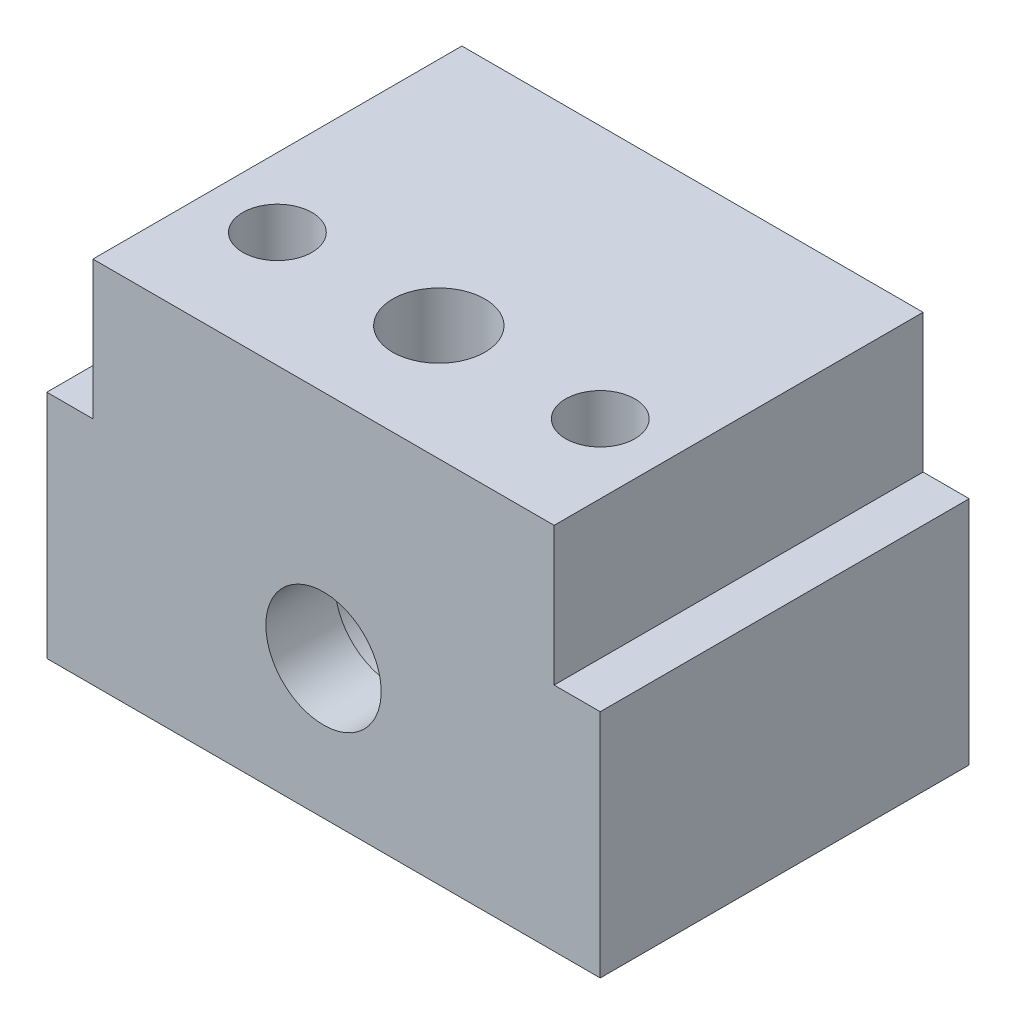
ISO-10303-21;
HEADER;
FILE_DESCRIPTION(('STEP AP214'),'2;1');
FILE_NAME('part.step','',(''),(''),'','','');
FILE_SCHEMA(('AUTOMOTIVE_DESIGN { 1 0 10303 214 1 1 1 1 }'));
ENDSEC;
DATA;
#1=APPLICATION_CONTEXT('core data for automotive mechanical design processes');
#2=APPLICATION_PROTOCOL_DEFINITION('international standard','automotive_design',2000,#1);
#3=PRODUCT_CONTEXT('',#1,'mechanical');
#4=PRODUCT('Part','Part','',(#3));
#5=PRODUCT_RELATED_PRODUCT_CATEGORY('part','',(#4));
#6=PRODUCT_DEFINITION_FORMATION('','',#4);
#7=PRODUCT_DEFINITION_CONTEXT('part definition',#1,'design');
#8=PRODUCT_DEFINITION('design','',#6,#7);
#9=PRODUCT_DEFINITION_SHAPE('','',#8);
#10=(LENGTH_UNIT() NAMED_UNIT(*) SI_UNIT(.MILLI.,.METRE.));
#11=(NAMED_UNIT(*) PLANE_ANGLE_UNIT() SI_UNIT($,.RADIAN.));
#12=(NAMED_UNIT(*) SI_UNIT($,.STERADIAN.) SOLID_ANGLE_UNIT());
#13=UNCERTAINTY_MEASURE_WITH_UNIT(LENGTH_MEASURE(1.E-05),#10,'distance_accuracy_value','');
#14=(GEOMETRIC_REPRESENTATION_CONTEXT(3) GLOBAL_UNCERTAINTY_ASSIGNED_CONTEXT((#13)) GLOBAL_UNIT_ASSIGNED_CONTEXT((#10,
#11,#12)) REPRESENTATION_CONTEXT('',''));
#15=CARTESIAN_POINT('',(0.,0.,0.));
#16=DIRECTION('',(0.,0.,1.));
#17=DIRECTION('',(1.,0.,0.));
#18=AXIS2_PLACEMENT_3D('',#15,#16,#17);
#19=CARTESIAN_POINT('',(24.13,0.,-6.35));
#20=DIRECTION('',(0.,1.,0.));
#21=DIRECTION('',(0.,0.,1.));
#22=AXIS2_PLACEMENT_3D('',#19,#20,#21);
#23=CYLINDRICAL_SURFACE('',#22,1.905);
#24=CARTESIAN_POINT('',(24.13,20.32,-6.35));
#25=DIRECTION('',(0.,1.,0.));
#26=DIRECTION('',(0.,0.,1.));
#27=AXIS2_PLACEMENT_3D('',#24,#25,#26);
#28=CIRCLE('',#27,1.905);
#29=CARTESIAN_POINT('',(24.13,20.32,-4.445));
#30=VERTEX_POINT('',#29);
#31=EDGE_CURVE('E322',#30,#30,#28,.T.);
#32=ORIENTED_EDGE('',*,*,#31,.T.);
#33=EDGE_LOOP('',(#32));
#34=FACE_BOUND('',#33,.T.);
#35=CARTESIAN_POINT('',(24.13,7.62,-6.35));
#36=DIRECTION('',(0.,-1.,0.));
#37=DIRECTION('',(1.,0.,0.));
#38=AXIS2_PLACEMENT_3D('',#35,#36,#37);
#39=CIRCLE('',#38,1.905);
#40=CARTESIAN_POINT('',(26.035,7.62,-6.35));
#41=VERTEX_POINT('',#40);
#42=EDGE_CURVE('E44',#41,#41,#39,.F.);
#43=ORIENTED_EDGE('',*,*,#42,.F.);
#44=EDGE_LOOP('',(#43));
#45=FACE_BOUND('',#44,.T.);
#46=ADVANCED_FACE('F40',(#34,#45),#23,.F.);
#47=CARTESIAN_POINT('',(6.35,0.,-6.35));
#48=DIRECTION('',(0.,1.,0.));
#49=DIRECTION('',(0.,0.,1.));
#50=AXIS2_PLACEMENT_3D('',#47,#48,#49);
#51=CYLINDRICAL_SURFACE('',#50,1.905);
#52=CARTESIAN_POINT('',(6.35,20.32,-6.35));
#53=DIRECTION('',(0.,1.,0.));
#54=DIRECTION('',(0.,0.,1.));
#55=AXIS2_PLACEMENT_3D('',#52,#53,#54);
#56=CIRCLE('',#55,1.905);
#57=CARTESIAN_POINT('',(6.35,20.32,-4.445));
#58=VERTEX_POINT('',#57);
#59=EDGE_CURVE('E332',#58,#58,#56,.T.);
#60=ORIENTED_EDGE('',*,*,#59,.T.);
#61=EDGE_LOOP('',(#60));
#62=FACE_BOUND('',#61,.T.);
#63=CARTESIAN_POINT('',(6.35,7.62,-6.35));
#64=DIRECTION('',(0.,-1.,0.));
#65=DIRECTION('',(1.,0.,0.));
#66=AXIS2_PLACEMENT_3D('',#63,#64,#65);
#67=CIRCLE('',#66,1.905);
#68=CARTESIAN_POINT('',(8.255,7.62,-6.35));
#69=VERTEX_POINT('',#68);
#70=EDGE_CURVE('E243',#69,#69,#67,.F.);
#71=ORIENTED_EDGE('',*,*,#70,.F.);
#72=EDGE_LOOP('',(#71));
#73=FACE_BOUND('',#72,.T.);
#74=ADVANCED_FACE('F445',(#62,#73),#51,.F.);
#75=CARTESIAN_POINT('',(30.48,0.,-20.32));
#76=DIRECTION('',(0.,-1.,0.));
#77=DIRECTION('',(1.,0.,0.));
#78=AXIS2_PLACEMENT_3D('',#75,#76,#77);
#79=PLANE('',#78);
#80=DIRECTION('',(-0.5,0.,-0.866025403784439));
#81=VECTOR('',#80,1.);
#82=CARTESIAN_POINT('',(4.15029547438752,0.,-2.54));
#83=LINE('',#82,#81);
#84=CARTESIAN_POINT('',(4.15029547438752,0.,-2.54));
#85=VERTEX_POINT('',#84);
#86=CARTESIAN_POINT('',(1.95059094877505,0.,-6.35));
#87=VERTEX_POINT('',#86);
#88=EDGE_CURVE('E58',#85,#87,#83,.T.);
#89=ORIENTED_EDGE('',*,*,#88,.F.);
#90=DIRECTION('',(-1.,0.,0.));
#91=VECTOR('',#90,1.);
#92=CARTESIAN_POINT('',(8.54970452561247,0.,-2.54));
#93=LINE('',#92,#91);
#94=CARTESIAN_POINT('',(8.54970452561247,0.,-2.54));
#95=VERTEX_POINT('',#94);
#96=EDGE_CURVE('E204',#95,#85,#93,.T.);
#97=ORIENTED_EDGE('',*,*,#96,.F.);
#98=DIRECTION('',(-0.5,0.,0.866025403784439));
#99=VECTOR('',#98,1.);
#100=CARTESIAN_POINT('',(10.7494090512249,0.,-6.35));
#101=LINE('',#100,#99);
#102=CARTESIAN_POINT('',(10.7494090512249,0.,-6.35));
#103=VERTEX_POINT('',#102);
#104=EDGE_CURVE('E209',#103,#95,#101,.T.);
#105=ORIENTED_EDGE('',*,*,#104,.F.);
#106=DIRECTION('',(0.5,0.,0.866025403784439));
#107=VECTOR('',#106,1.);
#108=CARTESIAN_POINT('',(8.54970452561247,0.,-10.16));
#109=LINE('',#108,#107);
#110=CARTESIAN_POINT('',(8.54970452561247,0.,-10.16));
#111=VERTEX_POINT('',#110);
#112=EDGE_CURVE('E233',#111,#103,#109,.T.);
#113=ORIENTED_EDGE('',*,*,#112,.F.);
#114=DIRECTION('',(1.,0.,0.));
#115=VECTOR('',#114,1.);
#116=CARTESIAN_POINT('',(4.15029547438752,0.,-10.16));
#117=LINE('',#116,#115);
#118=CARTESIAN_POINT('',(4.15029547438752,0.,-10.16));
#119=VERTEX_POINT('',#118);
#120=EDGE_CURVE('E229',#119,#111,#117,.T.);
#121=ORIENTED_EDGE('',*,*,#120,.F.);
#122=DIRECTION('',(0.5,0.,-0.866025403784439));
#123=VECTOR('',#122,1.);
#124=CARTESIAN_POINT('',(1.95059094877505,0.,-6.35));
#125=LINE('',#124,#123);
#126=EDGE_CURVE('E225',#87,#119,#125,.T.);
#127=ORIENTED_EDGE('',*,*,#126,.F.);
#128=EDGE_LOOP('',(#89,#97,#105,#113,#121,#127));
#129=FACE_BOUND('',#128,.T.);
#130=DIRECTION('',(-0.5,0.,-0.866025403784439));
#131=VECTOR('',#130,1.);
#132=CARTESIAN_POINT('',(21.9302954743875,0.,-2.54));
#133=LINE('',#132,#131);
#134=CARTESIAN_POINT('',(21.9302954743875,0.,-2.54));
#135=VERTEX_POINT('',#134);
#136=CARTESIAN_POINT('',(19.7305909487751,0.,-6.35));
#137=VERTEX_POINT('',#136);
#138=EDGE_CURVE('E66',#135,#137,#133,.T.);
#139=ORIENTED_EDGE('',*,*,#138,.F.);
#140=DIRECTION('',(-1.,0.,0.));
#141=VECTOR('',#140,1.);
#142=CARTESIAN_POINT('',(26.3297045256125,0.,-2.54));
#143=LINE('',#142,#141);
#144=CARTESIAN_POINT('',(26.3297045256125,0.,-2.54));
#145=VERTEX_POINT('',#144);
#146=EDGE_CURVE('E260',#145,#135,#143,.T.);
#147=ORIENTED_EDGE('',*,*,#146,.F.);
#148=DIRECTION('',(-0.499999999999999,0.,0.866025403784439));
#149=VECTOR('',#148,1.);
#150=CARTESIAN_POINT('',(28.5294090512249,0.,-6.35));
#151=LINE('',#150,#149);
#152=CARTESIAN_POINT('',(28.5294090512249,0.,-6.35));
#153=VERTEX_POINT('',#152);
#154=EDGE_CURVE('E295',#153,#145,#151,.T.);
#155=ORIENTED_EDGE('',*,*,#154,.F.);
#156=DIRECTION('',(0.499999999999999,0.,0.866025403784439));
#157=VECTOR('',#156,1.);
#158=CARTESIAN_POINT('',(26.3297045256125,0.,-10.16));
#159=LINE('',#158,#157);
#160=CARTESIAN_POINT('',(26.3297045256125,0.,-10.16));
#161=VERTEX_POINT('',#160);
#162=EDGE_CURVE('E291',#161,#153,#159,.T.);
#163=ORIENTED_EDGE('',*,*,#162,.F.);
#164=DIRECTION('',(1.,0.,0.));
#165=VECTOR('',#164,1.);
#166=CARTESIAN_POINT('',(21.9302954743875,0.,-10.16));
#167=LINE('',#166,#165);
#168=CARTESIAN_POINT('',(21.9302954743875,0.,-10.16));
#169=VERTEX_POINT('',#168);
#170=EDGE_CURVE('E287',#169,#161,#167,.T.);
#171=ORIENTED_EDGE('',*,*,#170,.F.);
#172=DIRECTION('',(0.5,0.,-0.866025403784439));
#173=VECTOR('',#172,1.);
#174=CARTESIAN_POINT('',(19.7305909487751,0.,-6.35));
#175=LINE('',#174,#173);
#176=EDGE_CURVE('E283',#137,#169,#175,.T.);
#177=ORIENTED_EDGE('',*,*,#176,.F.);
#178=EDGE_LOOP('',(#139,#147,#155,#163,#171,#177));
#179=FACE_BOUND('',#178,.T.);
#180=DIRECTION('',(1.,0.,0.));
#181=VECTOR('',#180,1.);
#182=CARTESIAN_POINT('',(30.48,0.,0.));
#183=LINE('',#182,#181);
#184=CARTESIAN_POINT('',(0.,0.,0.));
#185=VERTEX_POINT('',#184);
#186=CARTESIAN_POINT('',(30.48,0.,0.));
#187=VERTEX_POINT('',#186);
#188=EDGE_CURVE('E344',#185,#187,#183,.T.);
#189=ORIENTED_EDGE('',*,*,#188,.F.);
#190=DIRECTION('',(0.,0.,1.));
#191=VECTOR('',#190,1.);
#192=CARTESIAN_POINT('',(0.,0.,-20.32));
#193=LINE('',#192,#191);
#194=CARTESIAN_POINT('',(0.,0.,-20.32));
#195=VERTEX_POINT('',#194);
#196=EDGE_CURVE('E11',#195,#185,#193,.T.);
#197=ORIENTED_EDGE('',*,*,#196,.F.);
#198=DIRECTION('',(1.,0.,0.));
#199=VECTOR('',#198,1.);
#200=CARTESIAN_POINT('',(30.48,0.,-20.32));
#201=LINE('',#200,#199);
#202=CARTESIAN_POINT('',(30.48,0.,-20.32));
#203=VERTEX_POINT('',#202);
#204=EDGE_CURVE('E345',#195,#203,#201,.T.);
#205=ORIENTED_EDGE('',*,*,#204,.T.);
#206=DIRECTION('',(0.,0.,1.));
#207=VECTOR('',#206,1.);
#208=CARTESIAN_POINT('',(30.48,0.,-20.32));
#209=LINE('',#208,#207);
#210=EDGE_CURVE('E378',#203,#187,#209,.T.);
#211=ORIENTED_EDGE('',*,*,#210,.T.);
#212=EDGE_LOOP('',(#189,#197,#205,#211));
#213=FACE_BOUND('',#212,.T.);
#214=ADVANCED_FACE('F42',(#129,#179,#213),#79,.T.);
#215=CARTESIAN_POINT('',(0.,0.,-20.32));
#216=DIRECTION('',(-1.,0.,0.));
#217=DIRECTION('',(0.,0.,1.));
#218=AXIS2_PLACEMENT_3D('',#215,#216,#217);
#219=PLANE('',#218);
#220=DIRECTION('',(0.,-1.,0.));
#221=VECTOR('',#220,1.);
#222=CARTESIAN_POINT('',(0.,0.,0.));
#223=LINE('',#222,#221);
#224=CARTESIAN_POINT('',(0.,12.7,0.));
#225=VERTEX_POINT('',#224);
#226=EDGE_CURVE('E350',#225,#185,#223,.T.);
#227=ORIENTED_EDGE('',*,*,#226,.F.);
#228=DIRECTION('',(0.,0.,1.));
#229=VECTOR('',#228,1.);
#230=CARTESIAN_POINT('',(0.,12.7,-20.32));
#231=LINE('',#230,#229);
#232=CARTESIAN_POINT('',(0.,12.7,-20.32));
#233=VERTEX_POINT('',#232);
#234=EDGE_CURVE('E50',#233,#225,#231,.T.);
#235=ORIENTED_EDGE('',*,*,#234,.F.);
#236=DIRECTION('',(0.,-1.,0.));
#237=VECTOR('',#236,1.);
#238=CARTESIAN_POINT('',(0.,0.,-20.32));
#239=LINE('',#238,#237);
#240=EDGE_CURVE('E374',#233,#195,#239,.T.);
#241=ORIENTED_EDGE('',*,*,#240,.T.);
#242=ORIENTED_EDGE('',*,*,#196,.T.);
#243=EDGE_LOOP('',(#227,#235,#241,#242));
#244=FACE_BOUND('',#243,.T.);
#245=ADVANCED_FACE('F477',(#244),#219,.T.);
#246=CARTESIAN_POINT('',(0.,12.7,-20.32));
#247=DIRECTION('',(0.,1.,0.));
#248=DIRECTION('',(0.,0.,1.));
#249=AXIS2_PLACEMENT_3D('',#246,#247,#248);
#250=PLANE('',#249);
#251=DIRECTION('',(-1.,0.,0.));
#252=VECTOR('',#251,1.);
#253=CARTESIAN_POINT('',(0.,12.7,0.));
#254=LINE('',#253,#252);
#255=CARTESIAN_POINT('',(2.54,12.7,0.));
#256=VERTEX_POINT('',#255);
#257=EDGE_CURVE('E402',#256,#225,#254,.T.);
#258=ORIENTED_EDGE('',*,*,#257,.F.);
#259=DIRECTION('',(0.,0.,1.));
#260=VECTOR('',#259,1.);
#261=CARTESIAN_POINT('',(2.54,12.7,-20.32));
#262=LINE('',#261,#260);
#263=CARTESIAN_POINT('',(2.54,12.7,-20.32));
#264=VERTEX_POINT('',#263);
#265=EDGE_CURVE('E411',#264,#256,#262,.T.);
#266=ORIENTED_EDGE('',*,*,#265,.F.);
#267=DIRECTION('',(-1.,0.,0.));
#268=VECTOR('',#267,1.);
#269=CARTESIAN_POINT('',(0.,12.7,-20.32));
#270=LINE('',#269,#268);
#271=EDGE_CURVE('E370',#264,#233,#270,.T.);
#272=ORIENTED_EDGE('',*,*,#271,.T.);
#273=ORIENTED_EDGE('',*,*,#234,.T.);
#274=EDGE_LOOP('',(#258,#266,#272,#273));
#275=FACE_BOUND('',#274,.T.);
#276=ADVANCED_FACE('F480',(#275),#250,.T.);
#277=CARTESIAN_POINT('',(2.54,12.7,-20.32));
#278=DIRECTION('',(-1.,0.,0.));
#279=DIRECTION('',(0.,-1.,0.));
#280=AXIS2_PLACEMENT_3D('',#277,#278,#279);
#281=PLANE('',#280);
#282=DIRECTION('',(0.,-1.,0.));
#283=VECTOR('',#282,1.);
#284=CARTESIAN_POINT('',(2.54,12.7,0.));
#285=LINE('',#284,#283);
#286=CARTESIAN_POINT('',(2.54,20.32,0.));
#287=VERTEX_POINT('',#286);
#288=EDGE_CURVE('E398',#287,#256,#285,.T.);
#289=ORIENTED_EDGE('',*,*,#288,.F.);
#290=DIRECTION('',(0.,0.,1.));
#291=VECTOR('',#290,1.);
#292=CARTESIAN_POINT('',(2.54,20.32,-20.32));
#293=LINE('',#292,#291);
#294=CARTESIAN_POINT('',(2.54,20.32,-20.32));
#295=VERTEX_POINT('',#294);
#296=EDGE_CURVE('E414',#295,#287,#293,.T.);
#297=ORIENTED_EDGE('',*,*,#296,.F.);
#298=DIRECTION('',(0.,-1.,0.));
#299=VECTOR('',#298,1.);
#300=CARTESIAN_POINT('',(2.54,12.7,-20.32));
#301=LINE('',#300,#299);
#302=EDGE_CURVE('E366',#295,#264,#301,.T.);
#303=ORIENTED_EDGE('',*,*,#302,.T.);
#304=ORIENTED_EDGE('',*,*,#265,.T.);
#305=EDGE_LOOP('',(#289,#297,#303,#304));
#306=FACE_BOUND('',#305,.T.);
#307=ADVANCED_FACE('F484',(#306),#281,.T.);
#308=CARTESIAN_POINT('',(2.54,20.32,-20.32));
#309=DIRECTION('',(0.,1.,0.));
#310=DIRECTION('',(0.,0.,1.));
#311=AXIS2_PLACEMENT_3D('',#308,#309,#310);
#312=PLANE('',#311);
#313=CARTESIAN_POINT('',(15.24,20.32,-6.35));
#314=DIRECTION('',(0.,1.,0.));
#315=DIRECTION('',(0.,0.,1.));
#316=AXIS2_PLACEMENT_3D('',#313,#314,#315);
#317=CIRCLE('',#316,2.54);
#318=CARTESIAN_POINT('',(15.24,20.32,-3.81));
#319=VERTEX_POINT('',#318);
#320=EDGE_CURVE('E323',#319,#319,#317,.T.);
#321=ORIENTED_EDGE('',*,*,#320,.F.);
#322=EDGE_LOOP('',(#321));
#323=FACE_BOUND('',#322,.T.);
#324=ORIENTED_EDGE('',*,*,#59,.F.);
#325=EDGE_LOOP('',(#324));
#326=FACE_BOUND('',#325,.T.);
#327=ORIENTED_EDGE('',*,*,#31,.F.);
#328=EDGE_LOOP('',(#327));
#329=FACE_BOUND('',#328,.T.);
#330=DIRECTION('',(-1.,0.,0.));
#331=VECTOR('',#330,1.);
#332=CARTESIAN_POINT('',(2.54,20.32,0.));
#333=LINE('',#332,#331);
#334=CARTESIAN_POINT('',(27.94,20.32,0.));
#335=VERTEX_POINT('',#334);
#336=EDGE_CURVE('E394',#335,#287,#333,.T.);
#337=ORIENTED_EDGE('',*,*,#336,.F.);
#338=DIRECTION('',(0.,0.,1.));
#339=VECTOR('',#338,1.);
#340=CARTESIAN_POINT('',(27.94,20.32,-20.32));
#341=LINE('',#340,#339);
#342=CARTESIAN_POINT('',(27.94,20.32,-20.32));
#343=VERTEX_POINT('',#342);
#344=EDGE_CURVE('E417',#343,#335,#341,.T.);
#345=ORIENTED_EDGE('',*,*,#344,.F.);
#346=DIRECTION('',(-1.,0.,0.));
#347=VECTOR('',#346,1.);
#348=CARTESIAN_POINT('',(2.54,20.32,-20.32));
#349=LINE('',#348,#347);
#350=EDGE_CURVE('E362',#343,#295,#349,.T.);
#351=ORIENTED_EDGE('',*,*,#350,.T.);
#352=ORIENTED_EDGE('',*,*,#296,.T.);
#353=EDGE_LOOP('',(#337,#345,#351,#352));
#354=FACE_BOUND('',#353,.T.);
#355=ADVANCED_FACE('F488',(#323,#326,#329,#354),#312,.T.);
#356=CARTESIAN_POINT('',(27.94,20.32,-20.32));
#357=DIRECTION('',(1.,0.,0.));
#358=DIRECTION('',(0.,1.,0.));
#359=AXIS2_PLACEMENT_3D('',#356,#357,#358);
#360=PLANE('',#359);
#361=DIRECTION('',(0.,1.,0.));
#362=VECTOR('',#361,1.);
#363=CARTESIAN_POINT('',(27.94,20.32,0.));
#364=LINE('',#363,#362);
#365=CARTESIAN_POINT('',(27.94,12.7,0.));
#366=VERTEX_POINT('',#365);
#367=EDGE_CURVE('E390',#366,#335,#364,.T.);
#368=ORIENTED_EDGE('',*,*,#367,.F.);
#369=DIRECTION('',(0.,0.,1.));
#370=VECTOR('',#369,1.);
#371=CARTESIAN_POINT('',(27.94,12.7,-20.32));
#372=LINE('',#371,#370);
#373=CARTESIAN_POINT('',(27.94,12.7,-20.32));
#374=VERTEX_POINT('',#373);
#375=EDGE_CURVE('E420',#374,#366,#372,.T.);
#376=ORIENTED_EDGE('',*,*,#375,.F.);
#377=DIRECTION('',(0.,1.,0.));
#378=VECTOR('',#377,1.);
#379=CARTESIAN_POINT('',(27.94,20.32,-20.32));
#380=LINE('',#379,#378);
#381=EDGE_CURVE('E358',#374,#343,#380,.T.);
#382=ORIENTED_EDGE('',*,*,#381,.T.);
#383=ORIENTED_EDGE('',*,*,#344,.T.);
#384=EDGE_LOOP('',(#368,#376,#382,#383));
#385=FACE_BOUND('',#384,.T.);
#386=ADVANCED_FACE('F492',(#385),#360,.T.);
#387=CARTESIAN_POINT('',(27.94,12.7,-20.32));
#388=DIRECTION('',(0.,1.,0.));
#389=DIRECTION('',(0.,0.,1.));
#390=AXIS2_PLACEMENT_3D('',#387,#388,#389);
#391=PLANE('',#390);
#392=DIRECTION('',(-1.,0.,0.));
#393=VECTOR('',#392,1.);
#394=CARTESIAN_POINT('',(27.94,12.7,0.));
#395=LINE('',#394,#393);
#396=CARTESIAN_POINT('',(30.48,12.7,0.));
#397=VERTEX_POINT('',#396);
#398=EDGE_CURVE('E386',#397,#366,#395,.T.);
#399=ORIENTED_EDGE('',*,*,#398,.F.);
#400=DIRECTION('',(0.,0.,1.));
#401=VECTOR('',#400,1.);
#402=CARTESIAN_POINT('',(30.48,12.7,-20.32));
#403=LINE('',#402,#401);
#404=CARTESIAN_POINT('',(30.48,12.7,-20.32));
#405=VERTEX_POINT('',#404);
#406=EDGE_CURVE('E423',#405,#397,#403,.T.);
#407=ORIENTED_EDGE('',*,*,#406,.F.);
#408=DIRECTION('',(-1.,0.,0.));
#409=VECTOR('',#408,1.);
#410=CARTESIAN_POINT('',(27.94,12.7,-20.32));
#411=LINE('',#410,#409);
#412=EDGE_CURVE('E354',#405,#374,#411,.T.);
#413=ORIENTED_EDGE('',*,*,#412,.T.);
#414=ORIENTED_EDGE('',*,*,#375,.T.);
#415=EDGE_LOOP('',(#399,#407,#413,#414));
#416=FACE_BOUND('',#415,.T.);
#417=ADVANCED_FACE('F496',(#416),#391,.T.);
#418=CARTESIAN_POINT('',(30.48,12.7,-20.32));
#419=DIRECTION('',(1.,0.,0.));
#420=DIRECTION('',(0.,0.,-1.));
#421=AXIS2_PLACEMENT_3D('',#418,#419,#420);
#422=PLANE('',#421);
#423=DIRECTION('',(0.,1.,0.));
#424=VECTOR('',#423,1.);
#425=CARTESIAN_POINT('',(30.48,12.7,0.));
#426=LINE('',#425,#424);
#427=EDGE_CURVE('E382',#187,#397,#426,.T.);
#428=ORIENTED_EDGE('',*,*,#427,.F.);
#429=ORIENTED_EDGE('',*,*,#210,.F.);
#430=DIRECTION('',(0.,1.,0.));
#431=VECTOR('',#430,1.);
#432=CARTESIAN_POINT('',(30.48,12.7,-20.32));
#433=LINE('',#432,#431);
#434=EDGE_CURVE('E349',#203,#405,#433,.T.);
#435=ORIENTED_EDGE('',*,*,#434,.T.);
#436=ORIENTED_EDGE('',*,*,#406,.T.);
#437=EDGE_LOOP('',(#428,#429,#435,#436));
#438=FACE_BOUND('',#437,.T.);
#439=ADVANCED_FACE('F472',(#438),#422,.T.);
#440=CARTESIAN_POINT('',(0.,0.,-20.32));
#441=DIRECTION('',(0.,0.,-1.));
#442=DIRECTION('',(-1.,0.,0.));
#443=AXIS2_PLACEMENT_3D('',#440,#441,#442);
#444=PLANE('',#443);
#445=CARTESIAN_POINT('',(15.24,7.62,-20.32));
#446=DIRECTION('',(0.,0.,-1.));
#447=DIRECTION('',(-1.,0.,0.));
#448=AXIS2_PLACEMENT_3D('',#445,#446,#447);
#449=CIRCLE('',#448,4.445);
#450=CARTESIAN_POINT('',(10.795,7.62,-20.32));
#451=VERTEX_POINT('',#450);
#452=EDGE_CURVE('E327',#451,#451,#449,.T.);
#453=ORIENTED_EDGE('',*,*,#452,.F.);
#454=EDGE_LOOP('',(#453));
#455=FACE_BOUND('',#454,.T.);
#456=ORIENTED_EDGE('',*,*,#204,.F.);
#457=ORIENTED_EDGE('',*,*,#240,.F.);
#458=ORIENTED_EDGE('',*,*,#271,.F.);
#459=ORIENTED_EDGE('',*,*,#302,.F.);
#460=ORIENTED_EDGE('',*,*,#350,.F.);
#461=ORIENTED_EDGE('',*,*,#381,.F.);
#462=ORIENTED_EDGE('',*,*,#412,.F.);
#463=ORIENTED_EDGE('',*,*,#434,.F.);
#464=EDGE_LOOP('',(#456,#457,#458,#459,#460,#461,#462,#463));
#465=FACE_BOUND('',#464,.T.);
#466=ADVANCED_FACE('F469',(#455,#465),#444,.T.);
#467=CARTESIAN_POINT('',(0.,0.,0.));
#468=DIRECTION('',(0.,0.,-1.));
#469=DIRECTION('',(-1.,0.,0.));
#470=AXIS2_PLACEMENT_3D('',#467,#468,#469);
#471=PLANE('',#470);
#472=CARTESIAN_POINT('',(15.24,7.62,0.));
#473=DIRECTION('',(0.,0.,-1.));
#474=DIRECTION('',(-1.,0.,0.));
#475=AXIS2_PLACEMENT_3D('',#472,#473,#474);
#476=CIRCLE('',#475,3.175);
#477=CARTESIAN_POINT('',(12.065,7.62,0.));
#478=VERTEX_POINT('',#477);
#479=EDGE_CURVE('E340',#478,#478,#476,.T.);
#480=ORIENTED_EDGE('',*,*,#479,.T.);
#481=EDGE_LOOP('',(#480));
#482=FACE_BOUND('',#481,.T.);
#483=ORIENTED_EDGE('',*,*,#188,.T.);
#484=ORIENTED_EDGE('',*,*,#427,.T.);
#485=ORIENTED_EDGE('',*,*,#398,.T.);
#486=ORIENTED_EDGE('',*,*,#367,.T.);
#487=ORIENTED_EDGE('',*,*,#336,.T.);
#488=ORIENTED_EDGE('',*,*,#288,.T.);
#489=ORIENTED_EDGE('',*,*,#257,.T.);
#490=ORIENTED_EDGE('',*,*,#226,.T.);
#491=EDGE_LOOP('',(#483,#484,#485,#486,#487,#488,#489,#490));
#492=FACE_BOUND('',#491,.T.);
#493=ADVANCED_FACE('F467',(#482,#492),#471,.F.);
#494=CARTESIAN_POINT('',(15.24,7.62,-20.32));
#495=DIRECTION('',(0.,0.,-1.));
#496=DIRECTION('',(-1.,0.,0.));
#497=AXIS2_PLACEMENT_3D('',#494,#495,#496);
#498=CYLINDRICAL_SURFACE('',#497,3.175);
#499=ORIENTED_EDGE('',*,*,#479,.F.);
#500=EDGE_LOOP('',(#499));
#501=FACE_BOUND('',#500,.T.);
#502=CARTESIAN_POINT('',(15.24,7.62,-3.81));
#503=DIRECTION('',(0.,0.,-1.));
#504=DIRECTION('',(-1.,0.,0.));
#505=AXIS2_PLACEMENT_3D('',#502,#503,#504);
#506=CIRCLE('',#505,3.175);
#507=CARTESIAN_POINT('',(12.065,7.62,-3.81));
#508=VERTEX_POINT('',#507);
#509=EDGE_CURVE('E336',#508,#508,#506,.T.);
#510=ORIENTED_EDGE('',*,*,#509,.T.);
#511=EDGE_LOOP('',(#510));
#512=FACE_BOUND('',#511,.T.);
#513=ADVANCED_FACE('F463',(#501,#512),#498,.F.);
#514=CARTESIAN_POINT('',(18.415,7.62,-3.81));
#515=DIRECTION('',(0.,0.,1.));
#516=DIRECTION('',(1.,0.,0.));
#517=AXIS2_PLACEMENT_3D('',#514,#515,#516);
#518=PLANE('',#517);
#519=ORIENTED_EDGE('',*,*,#509,.F.);
#520=EDGE_LOOP('',(#519));
#521=FACE_BOUND('',#520,.T.);
#522=CARTESIAN_POINT('',(15.24,7.62,-3.81));
#523=DIRECTION('',(0.,0.,-1.));
#524=DIRECTION('',(-1.,0.,0.));
#525=AXIS2_PLACEMENT_3D('',#522,#523,#524);
#526=CIRCLE('',#525,4.445);
#527=CARTESIAN_POINT('',(10.795,7.62,-3.81));
#528=VERTEX_POINT('',#527);
#529=EDGE_CURVE('E331',#528,#528,#526,.T.);
#530=ORIENTED_EDGE('',*,*,#529,.T.);
#531=EDGE_LOOP('',(#530));
#532=FACE_BOUND('',#531,.T.);
#533=ADVANCED_FACE('F459',(#521,#532),#518,.F.);
#534=CARTESIAN_POINT('',(15.24,7.62,-20.32));
#535=DIRECTION('',(0.,0.,-1.));
#536=DIRECTION('',(-1.,0.,0.));
#537=AXIS2_PLACEMENT_3D('',#534,#535,#536);
#538=CYLINDRICAL_SURFACE('',#537,4.445);
#539=ORIENTED_EDGE('',*,*,#529,.F.);
#540=EDGE_LOOP('',(#539));
#541=FACE_BOUND('',#540,.T.);
#542=ORIENTED_EDGE('',*,*,#452,.T.);
#543=EDGE_LOOP('',(#542));
#544=FACE_BOUND('',#543,.T.);
#545=ADVANCED_FACE('F455',(#541,#544),#538,.F.);
#546=CARTESIAN_POINT('',(15.24,12.7,-6.35));
#547=DIRECTION('',(0.,1.,0.));
#548=DIRECTION('',(0.,0.,1.));
#549=AXIS2_PLACEMENT_3D('',#546,#547,#548);
#550=CYLINDRICAL_SURFACE('',#549,2.54);
#551=CARTESIAN_POINT('',(15.24,12.7,-6.35));
#552=DIRECTION('',(0.,1.,0.));
#553=DIRECTION('',(0.,0.,1.));
#554=AXIS2_PLACEMENT_3D('',#551,#552,#553);
#555=CIRCLE('',#554,2.54);
#556=CARTESIAN_POINT('',(15.24,12.7,-3.81));
#557=VERTEX_POINT('',#556);
#558=EDGE_CURVE('E318',#557,#557,#555,.T.);
#559=CARTESIAN_POINT('',(15.24,12.7,-3.81));
#560=CARTESIAN_POINT('',(15.24,12.779375,-3.81));
#561=CARTESIAN_POINT('',(15.24,12.85875,-3.81));
#562=CARTESIAN_POINT('',(15.24,13.0175,-3.81));
#563=CARTESIAN_POINT('',(15.24,13.096875,-3.81));
#564=CARTESIAN_POINT('',(15.24,13.255625,-3.81));
#565=CARTESIAN_POINT('',(15.24,13.335,-3.81));
#566=CARTESIAN_POINT('',(15.24,13.49375,-3.81));
#567=CARTESIAN_POINT('',(15.24,13.573125,-3.81));
#568=CARTESIAN_POINT('',(15.24,13.731875,-3.81));
#569=CARTESIAN_POINT('',(15.24,13.81125,-3.81));
#570=CARTESIAN_POINT('',(15.24,13.97,-3.81));
#571=CARTESIAN_POINT('',(15.24,14.049375,-3.81));
#572=CARTESIAN_POINT('',(15.24,14.208125,-3.81));
#573=CARTESIAN_POINT('',(15.24,14.2875,-3.81));
#574=CARTESIAN_POINT('',(15.24,14.44625,-3.81));
#575=CARTESIAN_POINT('',(15.24,14.525625,-3.81));
#576=CARTESIAN_POINT('',(15.24,14.684375,-3.81));
#577=CARTESIAN_POINT('',(15.24,14.76375,-3.81));
#578=CARTESIAN_POINT('',(15.24,14.9225,-3.81));
#579=CARTESIAN_POINT('',(15.24,15.001875,-3.81));
#580=CARTESIAN_POINT('',(15.24,15.160625,-3.81));
#581=CARTESIAN_POINT('',(15.24,15.24,-3.81));
#582=CARTESIAN_POINT('',(15.24,15.39875,-3.81));
#583=CARTESIAN_POINT('',(15.24,15.478125,-3.81));
#584=CARTESIAN_POINT('',(15.24,15.636875,-3.81));
#585=CARTESIAN_POINT('',(15.24,15.71625,-3.81));
#586=CARTESIAN_POINT('',(15.24,15.875,-3.81));
#587=CARTESIAN_POINT('',(15.24,15.954375,-3.81));
#588=CARTESIAN_POINT('',(15.24,16.113125,-3.81));
#589=CARTESIAN_POINT('',(15.24,16.1925,-3.81));
#590=CARTESIAN_POINT('',(15.24,16.35125,-3.81));
#591=CARTESIAN_POINT('',(15.24,16.430625,-3.81));
#592=CARTESIAN_POINT('',(15.24,16.589375,-3.81));
#593=CARTESIAN_POINT('',(15.24,16.66875,-3.81));
#594=CARTESIAN_POINT('',(15.24,16.8275,-3.81));
#595=CARTESIAN_POINT('',(15.24,16.906875,-3.81));
#596=CARTESIAN_POINT('',(15.24,17.065625,-3.81));
#597=CARTESIAN_POINT('',(15.24,17.145,-3.81));
#598=CARTESIAN_POINT('',(15.24,17.30375,-3.81));
#599=CARTESIAN_POINT('',(15.24,17.383125,-3.81));
#600=CARTESIAN_POINT('',(15.24,17.541875,-3.81));
#601=CARTESIAN_POINT('',(15.24,17.62125,-3.81));
#602=CARTESIAN_POINT('',(15.24,17.78,-3.81));
#603=CARTESIAN_POINT('',(15.24,17.859375,-3.81));
#604=CARTESIAN_POINT('',(15.24,18.018125,-3.81));
#605=CARTESIAN_POINT('',(15.24,18.0975,-3.81));
#606=CARTESIAN_POINT('',(15.24,18.25625,-3.81));
#607=CARTESIAN_POINT('',(15.24,18.335625,-3.81));
#608=CARTESIAN_POINT('',(15.24,18.494375,-3.81));
#609=CARTESIAN_POINT('',(15.24,18.57375,-3.81));
#610=CARTESIAN_POINT('',(15.24,18.7325,-3.81));
#611=CARTESIAN_POINT('',(15.24,18.811875,-3.81));
#612=CARTESIAN_POINT('',(15.24,18.970625,-3.81));
#613=CARTESIAN_POINT('',(15.24,19.05,-3.81));
#614=CARTESIAN_POINT('',(15.24,19.20875,-3.81));
#615=CARTESIAN_POINT('',(15.24,19.288125,-3.81));
#616=CARTESIAN_POINT('',(15.24,19.446875,-3.81));
#617=CARTESIAN_POINT('',(15.24,19.52625,-3.81));
#618=CARTESIAN_POINT('',(15.24,19.685,-3.81));
#619=CARTESIAN_POINT('',(15.24,19.764375,-3.81));
#620=CARTESIAN_POINT('',(15.24,19.923125,-3.81));
#621=CARTESIAN_POINT('',(15.24,20.0025,-3.81));
#622=CARTESIAN_POINT('',(15.24,20.16125,-3.81));
#623=CARTESIAN_POINT('',(15.24,20.240625,-3.81));
#624=CARTESIAN_POINT('',(15.24,20.32,-3.81));
#625=B_SPLINE_CURVE_WITH_KNOTS('',3,(#559,#560,#561,#562,#563,#564,#565,#566,#567,#568,#569,
#570,#571,#572,#573,#574,#575,#576,#577,#578,#579,#580,#581,#582,#583,#584,#585,#586,#587,#588,
#589,#590,#591,#592,#593,#594,#595,#596,#597,#598,#599,#600,#601,#602,#603,#604,#605,#606,#607,
#608,#609,#610,#611,#612,#613,#614,#615,#616,#617,#618,#619,#620,#621,#622,#623,#624),
.UNSPECIFIED.,.F.,.F.,(4,2,2,2,2,2,2,2,2,2,2,2,2,2,2,2,2,2,2,2,2,2,2,2,2,2,2,2,2,2,2,2,4),(0.,
0.238125,0.476250000000001,0.714375000000001,0.9525,1.190625,1.42875,1.666875,1.905,2.143125,
2.38125,2.619375,2.8575,3.095625,3.33375,3.571875,3.81,4.048125,4.28625,4.524375,4.7625,
5.000625,5.23875,5.476875,5.715,5.953125,6.19125,6.429375,6.6675,6.905625,7.14375,7.381875,
7.62),.UNSPECIFIED.);
#626=EDGE_CURVE('BSEAM458',#557,#319,#625,.T.);
#627=ORIENTED_EDGE('',*,*,#558,.F.);
#628=ORIENTED_EDGE('',*,*,#320,.T.);
#629=ORIENTED_EDGE('',*,*,#626,.T.);
#630=ORIENTED_EDGE('',*,*,#626,.F.);
#631=EDGE_LOOP('',(#627,#629,#628,#630));
#632=FACE_BOUND('',#631,.T.);
#633=ADVANCED_FACE('F458',(#632),#550,.F.);
#634=CARTESIAN_POINT('',(15.24,12.7,-6.35));
#635=DIRECTION('',(0.,1.,0.));
#636=DIRECTION('',(0.,0.,1.));
#637=AXIS2_PLACEMENT_3D('',#634,#635,#636);
#638=PLANE('',#637);
#639=ORIENTED_EDGE('',*,*,#558,.T.);
#640=EDGE_LOOP('',(#639));
#641=FACE_BOUND('',#640,.T.);
#642=ADVANCED_FACE('F565',(#641),#638,.T.);
#643=CARTESIAN_POINT('',(0.,7.62,0.));
#644=DIRECTION('',(0.,-1.,0.));
#645=DIRECTION('',(1.,0.,0.));
#646=AXIS2_PLACEMENT_3D('',#643,#644,#645);
#647=PLANE('',#646);
#648=DIRECTION('',(-0.5,0.,-0.866025403784439));
#649=VECTOR('',#648,1.);
#650=CARTESIAN_POINT('',(4.15029547438752,7.62,-2.54));
#651=LINE('',#650,#649);
#652=CARTESIAN_POINT('',(4.15029547438752,7.62,-2.54));
#653=VERTEX_POINT('',#652);
#654=CARTESIAN_POINT('',(1.95059094877505,7.62,-6.35));
#655=VERTEX_POINT('',#654);
#656=EDGE_CURVE('E181',#653,#655,#651,.T.);
#657=ORIENTED_EDGE('',*,*,#656,.T.);
#658=DIRECTION('',(0.5,0.,-0.866025403784439));
#659=VECTOR('',#658,1.);
#660=CARTESIAN_POINT('',(1.95059094877505,7.62,-6.35));
#661=LINE('',#660,#659);
#662=CARTESIAN_POINT('',(4.15029547438752,7.62,-10.16));
#663=VERTEX_POINT('',#662);
#664=EDGE_CURVE('E191',#655,#663,#661,.T.);
#665=ORIENTED_EDGE('',*,*,#664,.T.);
#666=DIRECTION('',(1.,0.,0.));
#667=VECTOR('',#666,1.);
#668=CARTESIAN_POINT('',(4.15029547438752,7.62,-10.16));
#669=LINE('',#668,#667);
#670=CARTESIAN_POINT('',(8.54970452561247,7.62,-10.16));
#671=VERTEX_POINT('',#670);
#672=EDGE_CURVE('E197',#663,#671,#669,.T.);
#673=ORIENTED_EDGE('',*,*,#672,.T.);
#674=DIRECTION('',(0.5,0.,0.866025403784439));
#675=VECTOR('',#674,1.);
#676=CARTESIAN_POINT('',(8.54970452561247,7.62,-10.16));
#677=LINE('',#676,#675);
#678=CARTESIAN_POINT('',(10.7494090512249,7.62,-6.35));
#679=VERTEX_POINT('',#678);
#680=EDGE_CURVE('E214',#671,#679,#677,.T.);
#681=ORIENTED_EDGE('',*,*,#680,.T.);
#682=DIRECTION('',(-0.5,0.,0.866025403784439));
#683=VECTOR('',#682,1.);
#684=CARTESIAN_POINT('',(10.7494090512249,7.62,-6.35));
#685=LINE('',#684,#683);
#686=CARTESIAN_POINT('',(8.54970452561247,7.62,-2.54));
#687=VERTEX_POINT('',#686);
#688=EDGE_CURVE('E218',#679,#687,#685,.T.);
#689=ORIENTED_EDGE('',*,*,#688,.T.);
#690=DIRECTION('',(-1.,0.,0.));
#691=VECTOR('',#690,1.);
#692=CARTESIAN_POINT('',(8.54970452561247,7.62,-2.54));
#693=LINE('',#692,#691);
#694=EDGE_CURVE('E188',#687,#653,#693,.T.);
#695=ORIENTED_EDGE('',*,*,#694,.T.);
#696=EDGE_LOOP('',(#657,#665,#673,#681,#689,#695));
#697=FACE_BOUND('',#696,.T.);
#698=ORIENTED_EDGE('',*,*,#70,.T.);
#699=EDGE_LOOP('',(#698));
#700=FACE_BOUND('',#699,.T.);
#701=ADVANCED_FACE('F199',(#697,#700),#647,.T.);
#702=CARTESIAN_POINT('',(4.15029547438752,7.62,-2.54));
#703=DIRECTION('',(-0.866025403784439,0.,0.5));
#704=DIRECTION('',(0.5,0.,0.866025403784439));
#705=AXIS2_PLACEMENT_3D('',#702,#703,#704);
#706=PLANE('',#705);
#707=ORIENTED_EDGE('',*,*,#88,.T.);
#708=DIRECTION('',(0.,-1.,0.));
#709=VECTOR('',#708,1.);
#710=CARTESIAN_POINT('',(1.95059094877505,7.62,-6.35));
#711=LINE('',#710,#709);
#712=EDGE_CURVE('E177',#655,#87,#711,.T.);
#713=ORIENTED_EDGE('',*,*,#712,.F.);
#714=ORIENTED_EDGE('',*,*,#656,.F.);
#715=DIRECTION('',(0.,-1.,0.));
#716=VECTOR('',#715,1.);
#717=CARTESIAN_POINT('',(4.15029547438752,7.62,-2.54));
#718=LINE('',#717,#716);
#719=EDGE_CURVE('E240',#653,#85,#718,.T.);
#720=ORIENTED_EDGE('',*,*,#719,.T.);
#721=EDGE_LOOP('',(#707,#713,#714,#720));
#722=FACE_BOUND('',#721,.T.);
#723=ADVANCED_FACE('F179',(#722),#706,.F.);
#724=CARTESIAN_POINT('',(8.54970452561247,7.62,-2.54));
#725=DIRECTION('',(0.,0.,1.));
#726=DIRECTION('',(1.,0.,0.));
#727=AXIS2_PLACEMENT_3D('',#724,#725,#726);
#728=PLANE('',#727);
#729=ORIENTED_EDGE('',*,*,#96,.T.);
#730=ORIENTED_EDGE('',*,*,#719,.F.);
#731=ORIENTED_EDGE('',*,*,#694,.F.);
#732=DIRECTION('',(0.,-1.,0.));
#733=VECTOR('',#732,1.);
#734=CARTESIAN_POINT('',(8.54970452561247,7.62,-2.54));
#735=LINE('',#734,#733);
#736=EDGE_CURVE('E244',#687,#95,#735,.T.);
#737=ORIENTED_EDGE('',*,*,#736,.T.);
#738=EDGE_LOOP('',(#729,#730,#731,#737));
#739=FACE_BOUND('',#738,.T.);
#740=ADVANCED_FACE('F598',(#739),#728,.F.);
#741=CARTESIAN_POINT('',(10.7494090512249,7.62,-6.35));
#742=DIRECTION('',(0.866025403784439,0.,0.5));
#743=DIRECTION('',(0.5,0.,-0.866025403784439));
#744=AXIS2_PLACEMENT_3D('',#741,#742,#743);
#745=PLANE('',#744);
#746=ORIENTED_EDGE('',*,*,#104,.T.);
#747=ORIENTED_EDGE('',*,*,#736,.F.);
#748=ORIENTED_EDGE('',*,*,#688,.F.);
#749=DIRECTION('',(0.,-1.,0.));
#750=VECTOR('',#749,1.);
#751=CARTESIAN_POINT('',(10.7494090512249,7.62,-6.35));
#752=LINE('',#751,#750);
#753=EDGE_CURVE('E247',#679,#103,#752,.T.);
#754=ORIENTED_EDGE('',*,*,#753,.T.);
#755=EDGE_LOOP('',(#746,#747,#748,#754));
#756=FACE_BOUND('',#755,.T.);
#757=ADVANCED_FACE('F605',(#756),#745,.F.);
#758=CARTESIAN_POINT('',(8.54970452561247,7.62,-10.16));
#759=DIRECTION('',(0.866025403784439,0.,-0.5));
#760=DIRECTION('',(-0.5,0.,-0.866025403784439));
#761=AXIS2_PLACEMENT_3D('',#758,#759,#760);
#762=PLANE('',#761);
#763=ORIENTED_EDGE('',*,*,#112,.T.);
#764=ORIENTED_EDGE('',*,*,#753,.F.);
#765=ORIENTED_EDGE('',*,*,#680,.F.);
#766=DIRECTION('',(0.,-1.,0.));
#767=VECTOR('',#766,1.);
#768=CARTESIAN_POINT('',(8.54970452561247,7.62,-10.16));
#769=LINE('',#768,#767);
#770=EDGE_CURVE('E250',#671,#111,#769,.T.);
#771=ORIENTED_EDGE('',*,*,#770,.T.);
#772=EDGE_LOOP('',(#763,#764,#765,#771));
#773=FACE_BOUND('',#772,.T.);
#774=ADVANCED_FACE('F613',(#773),#762,.F.);
#775=CARTESIAN_POINT('',(4.15029547438752,7.62,-10.16));
#776=DIRECTION('',(0.,0.,-1.));
#777=DIRECTION('',(-1.,0.,0.));
#778=AXIS2_PLACEMENT_3D('',#775,#776,#777);
#779=PLANE('',#778);
#780=ORIENTED_EDGE('',*,*,#120,.T.);
#781=ORIENTED_EDGE('',*,*,#770,.F.);
#782=ORIENTED_EDGE('',*,*,#672,.F.);
#783=DIRECTION('',(0.,-1.,0.));
#784=VECTOR('',#783,1.);
#785=CARTESIAN_POINT('',(4.15029547438752,7.62,-10.16));
#786=LINE('',#785,#784);
#787=EDGE_CURVE('E187',#663,#119,#786,.T.);
#788=ORIENTED_EDGE('',*,*,#787,.T.);
#789=EDGE_LOOP('',(#780,#781,#782,#788));
#790=FACE_BOUND('',#789,.T.);
#791=ADVANCED_FACE('F621',(#790),#779,.F.);
#792=CARTESIAN_POINT('',(1.95059094877505,7.62,-6.35));
#793=DIRECTION('',(-0.866025403784439,0.,-0.5));
#794=DIRECTION('',(-0.5,0.,0.866025403784439));
#795=AXIS2_PLACEMENT_3D('',#792,#793,#794);
#796=PLANE('',#795);
#797=ORIENTED_EDGE('',*,*,#126,.T.);
#798=ORIENTED_EDGE('',*,*,#787,.F.);
#799=ORIENTED_EDGE('',*,*,#664,.F.);
#800=ORIENTED_EDGE('',*,*,#712,.T.);
#801=EDGE_LOOP('',(#797,#798,#799,#800));
#802=FACE_BOUND('',#801,.T.);
#803=ADVANCED_FACE('F192',(#802),#796,.F.);
#804=CARTESIAN_POINT('',(0.,7.62,0.));
#805=DIRECTION('',(0.,-1.,0.));
#806=DIRECTION('',(1.,0.,0.));
#807=AXIS2_PLACEMENT_3D('',#804,#805,#806);
#808=PLANE('',#807);
#809=DIRECTION('',(-0.5,0.,-0.866025403784439));
#810=VECTOR('',#809,1.);
#811=CARTESIAN_POINT('',(21.9302954743875,7.62,-2.54));
#812=LINE('',#811,#810);
#813=CARTESIAN_POINT('',(21.9302954743875,7.62,-2.54));
#814=VERTEX_POINT('',#813);
#815=CARTESIAN_POINT('',(19.7305909487751,7.62,-6.35));
#816=VERTEX_POINT('',#815);
#817=EDGE_CURVE('E255',#814,#816,#812,.T.);
#818=ORIENTED_EDGE('',*,*,#817,.T.);
#819=DIRECTION('',(0.5,0.,-0.866025403784439));
#820=VECTOR('',#819,1.);
#821=CARTESIAN_POINT('',(19.7305909487751,7.62,-6.35));
#822=LINE('',#821,#820);
#823=CARTESIAN_POINT('',(21.9302954743875,7.62,-10.16));
#824=VERTEX_POINT('',#823);
#825=EDGE_CURVE('E259',#816,#824,#822,.T.);
#826=ORIENTED_EDGE('',*,*,#825,.T.);
#827=DIRECTION('',(1.,0.,0.));
#828=VECTOR('',#827,1.);
#829=CARTESIAN_POINT('',(21.9302954743875,7.62,-10.16));
#830=LINE('',#829,#828);
#831=CARTESIAN_POINT('',(26.3297045256125,7.62,-10.16));
#832=VERTEX_POINT('',#831);
#833=EDGE_CURVE('E264',#824,#832,#830,.T.);
#834=ORIENTED_EDGE('',*,*,#833,.T.);
#835=DIRECTION('',(0.499999999999999,0.,0.866025403784439));
#836=VECTOR('',#835,1.);
#837=CARTESIAN_POINT('',(26.3297045256125,7.62,-10.16));
#838=LINE('',#837,#836);
#839=CARTESIAN_POINT('',(28.5294090512249,7.62,-6.35));
#840=VERTEX_POINT('',#839);
#841=EDGE_CURVE('E268',#832,#840,#838,.T.);
#842=ORIENTED_EDGE('',*,*,#841,.T.);
#843=DIRECTION('',(-0.499999999999999,0.,0.866025403784439));
#844=VECTOR('',#843,1.);
#845=CARTESIAN_POINT('',(28.5294090512249,7.62,-6.35));
#846=LINE('',#845,#844);
#847=CARTESIAN_POINT('',(26.3297045256125,7.62,-2.54));
#848=VERTEX_POINT('',#847);
#849=EDGE_CURVE('E272',#840,#848,#846,.T.);
#850=ORIENTED_EDGE('',*,*,#849,.T.);
#851=DIRECTION('',(-1.,0.,0.));
#852=VECTOR('',#851,1.);
#853=CARTESIAN_POINT('',(26.3297045256125,7.62,-2.54));
#854=LINE('',#853,#852);
#855=EDGE_CURVE('E276',#848,#814,#854,.T.);
#856=ORIENTED_EDGE('',*,*,#855,.T.);
#857=EDGE_LOOP('',(#818,#826,#834,#842,#850,#856));
#858=FACE_BOUND('',#857,.T.);
#859=ORIENTED_EDGE('',*,*,#42,.T.);
#860=EDGE_LOOP('',(#859));
#861=FACE_BOUND('',#860,.T.);
#862=ADVANCED_FACE('F442',(#858,#861),#808,.T.);
#863=CARTESIAN_POINT('',(21.9302954743875,7.62,-2.54));
#864=DIRECTION('',(-0.866025403784439,0.,0.5));
#865=DIRECTION('',(0.5,0.,0.866025403784439));
#866=AXIS2_PLACEMENT_3D('',#863,#864,#865);
#867=PLANE('',#866);
#868=ORIENTED_EDGE('',*,*,#138,.T.);
#869=DIRECTION('',(0.,-1.,0.));
#870=VECTOR('',#869,1.);
#871=CARTESIAN_POINT('',(19.7305909487751,7.62,-6.35));
#872=LINE('',#871,#870);
#873=EDGE_CURVE('E280',#816,#137,#872,.T.);
#874=ORIENTED_EDGE('',*,*,#873,.F.);
#875=ORIENTED_EDGE('',*,*,#817,.F.);
#876=DIRECTION('',(0.,-1.,0.));
#877=VECTOR('',#876,1.);
#878=CARTESIAN_POINT('',(21.9302954743875,7.62,-2.54));
#879=LINE('',#878,#877);
#880=EDGE_CURVE('E226',#814,#135,#879,.T.);
#881=ORIENTED_EDGE('',*,*,#880,.T.);
#882=EDGE_LOOP('',(#868,#874,#875,#881));
#883=FACE_BOUND('',#882,.T.);
#884=ADVANCED_FACE('F540',(#883),#867,.F.);
#885=CARTESIAN_POINT('',(26.3297045256125,7.62,-2.54));
#886=DIRECTION('',(0.,0.,1.));
#887=DIRECTION('',(1.,0.,0.));
#888=AXIS2_PLACEMENT_3D('',#885,#886,#887);
#889=PLANE('',#888);
#890=ORIENTED_EDGE('',*,*,#146,.T.);
#891=ORIENTED_EDGE('',*,*,#880,.F.);
#892=ORIENTED_EDGE('',*,*,#855,.F.);
#893=DIRECTION('',(0.,-1.,0.));
#894=VECTOR('',#893,1.);
#895=CARTESIAN_POINT('',(26.3297045256125,7.62,-2.54));
#896=LINE('',#895,#894);
#897=EDGE_CURVE('E304',#848,#145,#896,.T.);
#898=ORIENTED_EDGE('',*,*,#897,.T.);
#899=EDGE_LOOP('',(#890,#891,#892,#898));
#900=FACE_BOUND('',#899,.T.);
#901=ADVANCED_FACE('F545',(#900),#889,.F.);
#902=CARTESIAN_POINT('',(28.5294090512249,7.62,-6.35));
#903=DIRECTION('',(0.866025403784439,0.,0.499999999999999));
#904=DIRECTION('',(0.499999999999999,0.,-0.866025403784439));
#905=AXIS2_PLACEMENT_3D('',#902,#903,#904);
#906=PLANE('',#905);
#907=ORIENTED_EDGE('',*,*,#154,.T.);
#908=ORIENTED_EDGE('',*,*,#897,.F.);
#909=ORIENTED_EDGE('',*,*,#849,.F.);
#910=DIRECTION('',(0.,-1.,0.));
#911=VECTOR('',#910,1.);
#912=CARTESIAN_POINT('',(28.5294090512249,7.62,-6.35));
#913=LINE('',#912,#911);
#914=EDGE_CURVE('E307',#840,#153,#913,.T.);
#915=ORIENTED_EDGE('',*,*,#914,.T.);
#916=EDGE_LOOP('',(#907,#908,#909,#915));
#917=FACE_BOUND('',#916,.T.);
#918=ADVANCED_FACE('F547',(#917),#906,.F.);
#919=CARTESIAN_POINT('',(26.3297045256125,7.62,-10.16));
#920=DIRECTION('',(0.866025403784439,0.,-0.499999999999999));
#921=DIRECTION('',(-0.499999999999999,0.,-0.866025403784439));
#922=AXIS2_PLACEMENT_3D('',#919,#920,#921);
#923=PLANE('',#922);
#924=ORIENTED_EDGE('',*,*,#162,.T.);
#925=ORIENTED_EDGE('',*,*,#914,.F.);
#926=ORIENTED_EDGE('',*,*,#841,.F.);
#927=DIRECTION('',(0.,-1.,0.));
#928=VECTOR('',#927,1.);
#929=CARTESIAN_POINT('',(26.3297045256125,7.62,-10.16));
#930=LINE('',#929,#928);
#931=EDGE_CURVE('E310',#832,#161,#930,.T.);
#932=ORIENTED_EDGE('',*,*,#931,.T.);
#933=EDGE_LOOP('',(#924,#925,#926,#932));
#934=FACE_BOUND('',#933,.T.);
#935=ADVANCED_FACE('F549',(#934),#923,.F.);
#936=CARTESIAN_POINT('',(21.9302954743875,7.62,-10.16));
#937=DIRECTION('',(0.,0.,-1.));
#938=DIRECTION('',(-1.,0.,0.));
#939=AXIS2_PLACEMENT_3D('',#936,#937,#938);
#940=PLANE('',#939);
#941=ORIENTED_EDGE('',*,*,#170,.T.);
#942=ORIENTED_EDGE('',*,*,#931,.F.);
#943=ORIENTED_EDGE('',*,*,#833,.F.);
#944=DIRECTION('',(0.,-1.,0.));
#945=VECTOR('',#944,1.);
#946=CARTESIAN_POINT('',(21.9302954743875,7.62,-10.16));
#947=LINE('',#946,#945);
#948=EDGE_CURVE('E313',#824,#169,#947,.T.);
#949=ORIENTED_EDGE('',*,*,#948,.T.);
#950=EDGE_LOOP('',(#941,#942,#943,#949));
#951=FACE_BOUND('',#950,.T.);
#952=ADVANCED_FACE('F552',(#951),#940,.F.);
#953=CARTESIAN_POINT('',(19.7305909487751,7.62,-6.35));
#954=DIRECTION('',(-0.866025403784439,0.,-0.5));
#955=DIRECTION('',(-0.5,0.,0.866025403784439));
#956=AXIS2_PLACEMENT_3D('',#953,#954,#955);
#957=PLANE('',#956);
#958=ORIENTED_EDGE('',*,*,#176,.T.);
#959=ORIENTED_EDGE('',*,*,#948,.F.);
#960=ORIENTED_EDGE('',*,*,#825,.F.);
#961=ORIENTED_EDGE('',*,*,#873,.T.);
#962=EDGE_LOOP('',(#958,#959,#960,#961));
#963=FACE_BOUND('',#962,.T.);
#964=ADVANCED_FACE('F536',(#963),#957,.F.);
#965=CLOSED_SHELL('',(#46,#74,#214,#245,#276,#307,#355,#386,#417,#439,#466,#493,#513,#533,#545,
#633,#642,#701,#723,#740,#757,#774,#791,#803,#862,#884,#901,#918,#935,#952,#964));
#966=MANIFOLD_SOLID_BREP('B2',#965);
#967=ADVANCED_BREP_SHAPE_REPRESENTATION('',(#18,#966),#14);
#968=SHAPE_DEFINITION_REPRESENTATION(#9,#967);
ENDSEC;
END-ISO-10303-21;
